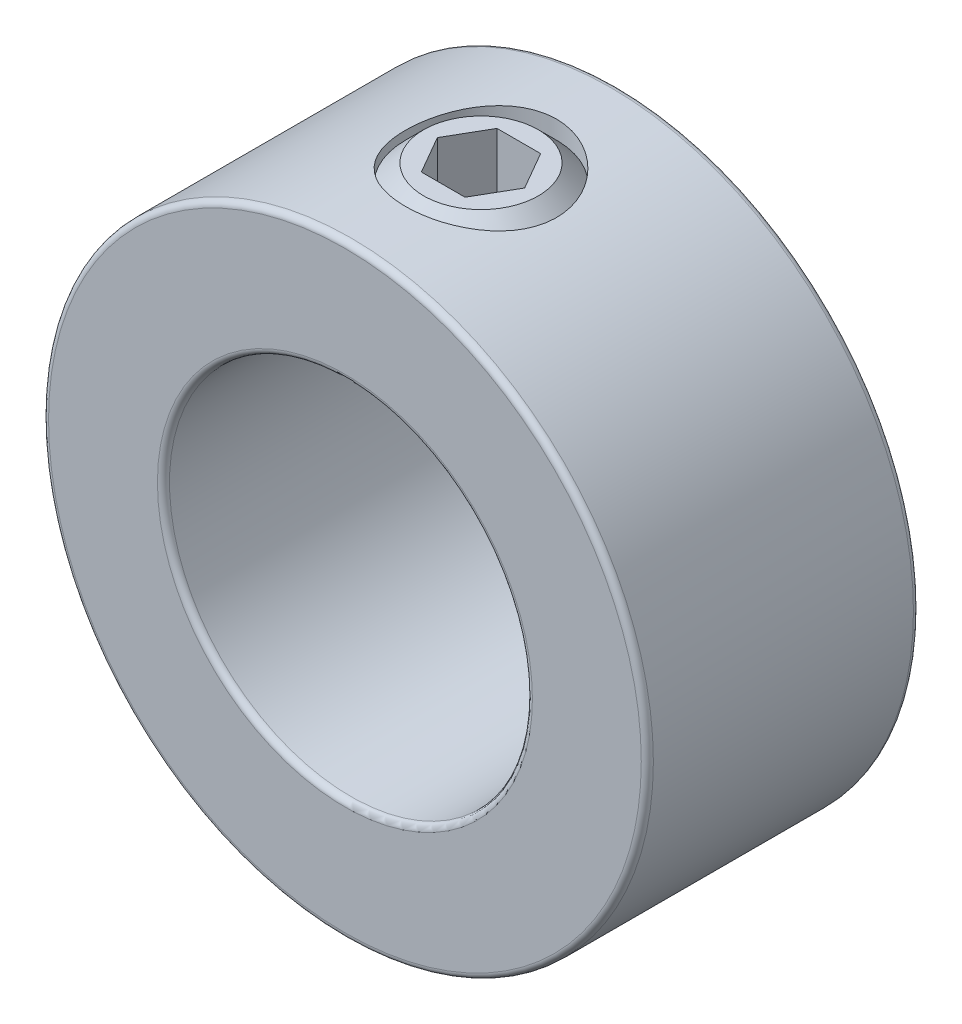
ISO-10303-21;
HEADER;
FILE_DESCRIPTION(('STEP AP214'),'2;1');
FILE_NAME('part.step','',(''),(''),'','','');
FILE_SCHEMA(('AUTOMOTIVE_DESIGN { 1 0 10303 214 1 1 1 1 }'));
ENDSEC;
DATA;
#1=APPLICATION_CONTEXT('core data for automotive mechanical design processes');
#2=APPLICATION_PROTOCOL_DEFINITION('international standard','automotive_design',2000,#1);
#3=PRODUCT_CONTEXT('',#1,'mechanical');
#4=PRODUCT('Part','Part','',(#3));
#5=PRODUCT_RELATED_PRODUCT_CATEGORY('part','',(#4));
#6=PRODUCT_DEFINITION_FORMATION('','',#4);
#7=PRODUCT_DEFINITION_CONTEXT('part definition',#1,'design');
#8=PRODUCT_DEFINITION('design','',#6,#7);
#9=PRODUCT_DEFINITION_SHAPE('','',#8);
#10=(LENGTH_UNIT() NAMED_UNIT(*) SI_UNIT(.MILLI.,.METRE.));
#11=(NAMED_UNIT(*) PLANE_ANGLE_UNIT() SI_UNIT($,.RADIAN.));
#12=(NAMED_UNIT(*) SI_UNIT($,.STERADIAN.) SOLID_ANGLE_UNIT());
#13=UNCERTAINTY_MEASURE_WITH_UNIT(LENGTH_MEASURE(1.E-05),#10,'distance_accuracy_value','');
#14=(GEOMETRIC_REPRESENTATION_CONTEXT(3) GLOBAL_UNCERTAINTY_ASSIGNED_CONTEXT((#13)) GLOBAL_UNIT_ASSIGNED_CONTEXT((#10,
#11,#12)) REPRESENTATION_CONTEXT('',''));
#15=CARTESIAN_POINT('',(0.,0.,0.));
#16=DIRECTION('',(0.,0.,1.));
#17=DIRECTION('',(1.,0.,0.));
#18=AXIS2_PLACEMENT_3D('',#15,#16,#17);
#19=CARTESIAN_POINT('',(0.,15.875,0.));
#20=DIRECTION('',(0.,1.,0.));
#21=DIRECTION('',(-1.,0.,0.));
#22=AXIS2_PLACEMENT_3D('',#19,#20,#21);
#23=PLANE('',#22);
#24=CARTESIAN_POINT('',(0.,15.875,0.));
#25=DIRECTION('',(0.,1.,0.));
#26=DIRECTION('',(-1.,0.,0.));
#27=AXIS2_PLACEMENT_3D('',#24,#25,#26);
#28=CIRCLE('',#27,3.01024078905504);
#29=CARTESIAN_POINT('',(-3.01024078905504,15.875,0.));
#30=VERTEX_POINT('',#29);
#31=EDGE_CURVE('E12',#30,#30,#28,.T.);
#32=ORIENTED_EDGE('',*,*,#31,.T.);
#33=EDGE_LOOP('',(#32));
#34=FACE_BOUND('',#33,.T.);
#35=DIRECTION('',(1.,0.,0.));
#36=VECTOR('',#35,1.);
#37=CARTESIAN_POINT('',(-1.14567944042316,15.875,-1.984375));
#38=LINE('',#37,#36);
#39=CARTESIAN_POINT('',(-1.14567944042316,15.875,-1.984375));
#40=VERTEX_POINT('',#39);
#41=CARTESIAN_POINT('',(1.14567944042317,15.875,-1.984375));
#42=VERTEX_POINT('',#41);
#43=EDGE_CURVE('E108',#40,#42,#38,.T.);
#44=ORIENTED_EDGE('',*,*,#43,.T.);
#45=DIRECTION('',(0.5,0.,0.866025403784439));
#46=VECTOR('',#45,1.);
#47=CARTESIAN_POINT('',(1.14567944042317,15.875,-1.984375));
#48=LINE('',#47,#46);
#49=CARTESIAN_POINT('',(2.29135888084633,15.875,0.));
#50=VERTEX_POINT('',#49);
#51=EDGE_CURVE('E54',#42,#50,#48,.T.);
#52=ORIENTED_EDGE('',*,*,#51,.T.);
#53=DIRECTION('',(-0.5,0.,0.866025403784439));
#54=VECTOR('',#53,1.);
#55=CARTESIAN_POINT('',(2.29135888084633,15.875,0.));
#56=LINE('',#55,#54);
#57=CARTESIAN_POINT('',(1.14567944042317,15.875,1.984375));
#58=VERTEX_POINT('',#57);
#59=EDGE_CURVE('E112',#50,#58,#56,.T.);
#60=ORIENTED_EDGE('',*,*,#59,.T.);
#61=DIRECTION('',(-1.,0.,0.));
#62=VECTOR('',#61,1.);
#63=CARTESIAN_POINT('',(1.14567944042317,15.875,1.984375));
#64=LINE('',#63,#62);
#65=CARTESIAN_POINT('',(-1.14567944042316,15.875,1.984375));
#66=VERTEX_POINT('',#65);
#67=EDGE_CURVE('E175',#58,#66,#64,.T.);
#68=ORIENTED_EDGE('',*,*,#67,.T.);
#69=DIRECTION('',(-0.5,0.,-0.866025403784438));
#70=VECTOR('',#69,1.);
#71=CARTESIAN_POINT('',(-1.14567944042316,15.875,1.984375));
#72=LINE('',#71,#70);
#73=CARTESIAN_POINT('',(-2.29135888084633,15.875,0.));
#74=VERTEX_POINT('',#73);
#75=EDGE_CURVE('E160',#66,#74,#72,.T.);
#76=ORIENTED_EDGE('',*,*,#75,.T.);
#77=DIRECTION('',(0.5,0.,-0.866025403784438));
#78=VECTOR('',#77,1.);
#79=CARTESIAN_POINT('',(-2.29135888084633,15.875,0.));
#80=LINE('',#79,#78);
#81=EDGE_CURVE('E156',#74,#40,#80,.T.);
#82=ORIENTED_EDGE('',*,*,#81,.T.);
#83=EDGE_LOOP('',(#44,#52,#60,#68,#76,#82));
#84=FACE_BOUND('',#83,.T.);
#85=ADVANCED_FACE('F40',(#34,#84),#23,.T.);
#86=CARTESIAN_POINT('',(0.,15.875,0.));
#87=DIRECTION('',(0.,-1.,0.));
#88=DIRECTION('',(1.,0.,0.));
#89=AXIS2_PLACEMENT_3D('',#86,#87,#88);
#90=CONICAL_SURFACE('',#89,3.01024078905504,0.785398163397448);
#91=CARTESIAN_POINT('',(0.,14.916490789055,0.));
#92=DIRECTION('',(0.,1.,0.));
#93=DIRECTION('',(-1.,0.,0.));
#94=AXIS2_PLACEMENT_3D('',#91,#92,#93);
#95=CIRCLE('',#94,3.96875);
#96=CARTESIAN_POINT('',(-3.96875,14.916490789055,0.));
#97=VERTEX_POINT('',#96);
#98=EDGE_CURVE('E47',#97,#97,#95,.T.);
#99=ORIENTED_EDGE('',*,*,#98,.T.);
#100=EDGE_LOOP('',(#99));
#101=FACE_BOUND('',#100,.T.);
#102=ORIENTED_EDGE('',*,*,#31,.F.);
#103=EDGE_LOOP('',(#102));
#104=FACE_BOUND('',#103,.T.);
#105=ADVANCED_FACE('F130',(#101,#104),#90,.T.);
#106=CARTESIAN_POINT('',(0.,9.525,0.));
#107=DIRECTION('',(0.,1.,0.));
#108=DIRECTION('',(-1.,0.,0.));
#109=AXIS2_PLACEMENT_3D('',#106,#107,#108);
#110=CYLINDRICAL_SURFACE('',#109,3.96875);
#111=CARTESIAN_POINT('',(0.,10.483509210945,0.));
#112=DIRECTION('',(0.,1.,0.));
#113=DIRECTION('',(-1.,0.,0.));
#114=AXIS2_PLACEMENT_3D('',#111,#112,#113);
#115=CIRCLE('',#114,3.96875);
#116=CARTESIAN_POINT('',(-3.96875,10.483509210945,0.));
#117=VERTEX_POINT('',#116);
#118=EDGE_CURVE('E125',#117,#117,#115,.T.);
#119=ORIENTED_EDGE('',*,*,#118,.T.);
#120=EDGE_LOOP('',(#119));
#121=FACE_BOUND('',#120,.T.);
#122=ORIENTED_EDGE('',*,*,#98,.F.);
#123=EDGE_LOOP('',(#122));
#124=FACE_BOUND('',#123,.T.);
#125=ADVANCED_FACE('F133',(#121,#124),#110,.T.);
#126=CARTESIAN_POINT('',(0.,10.483509210945,0.));
#127=DIRECTION('',(0.,1.,0.));
#128=DIRECTION('',(-1.,0.,0.));
#129=AXIS2_PLACEMENT_3D('',#126,#127,#128);
#130=CONICAL_SURFACE('',#129,3.96875,0.785398163397448);
#131=CARTESIAN_POINT('',(0.,9.525,0.));
#132=DIRECTION('',(0.,1.,0.));
#133=DIRECTION('',(-1.,0.,0.));
#134=AXIS2_PLACEMENT_3D('',#131,#132,#133);
#135=CIRCLE('',#134,3.01024078905504);
#136=CARTESIAN_POINT('',(-3.01024078905504,9.525,0.));
#137=VERTEX_POINT('',#136);
#138=EDGE_CURVE('E117',#137,#137,#135,.T.);
#139=ORIENTED_EDGE('',*,*,#138,.T.);
#140=EDGE_LOOP('',(#139));
#141=FACE_BOUND('',#140,.T.);
#142=ORIENTED_EDGE('',*,*,#118,.F.);
#143=EDGE_LOOP('',(#142));
#144=FACE_BOUND('',#143,.T.);
#145=ADVANCED_FACE('F135',(#141,#144),#130,.T.);
#146=CARTESIAN_POINT('',(-3.01024078905504,9.525,0.));
#147=DIRECTION('',(0.,-1.,0.));
#148=DIRECTION('',(1.,0.,0.));
#149=AXIS2_PLACEMENT_3D('',#146,#147,#148);
#150=PLANE('',#149);
#151=CARTESIAN_POINT('',(0.,9.525,0.));
#152=DIRECTION('',(0.,1.,0.));
#153=DIRECTION('',(-1.,0.,0.));
#154=AXIS2_PLACEMENT_3D('',#151,#152,#153);
#155=CIRCLE('',#154,1.15021105313395);
#156=CARTESIAN_POINT('',(-1.15021105313395,9.525,0.));
#157=VERTEX_POINT('',#156);
#158=EDGE_CURVE('E113',#157,#157,#155,.T.);
#159=ORIENTED_EDGE('',*,*,#158,.T.);
#160=EDGE_LOOP('',(#159));
#161=FACE_BOUND('',#160,.T.);
#162=ORIENTED_EDGE('',*,*,#138,.F.);
#163=EDGE_LOOP('',(#162));
#164=FACE_BOUND('',#163,.T.);
#165=ADVANCED_FACE('F142',(#161,#164),#150,.T.);
#166=CARTESIAN_POINT('',(0.,9.525,0.));
#167=DIRECTION('',(0.,-1.,0.));
#168=DIRECTION('',(1.,0.,0.));
#169=AXIS2_PLACEMENT_3D('',#166,#167,#168);
#170=CONICAL_SURFACE('',#169,1.15021105313395,0.785398163397449);
#171=CARTESIAN_POINT('',(0.,10.6752110531339,0.));
#172=VERTEX_POINT('',#171);
#173=VERTEX_LOOP('',#172);
#174=FACE_BOUND('',#173,.T.);
#175=ORIENTED_EDGE('',*,*,#158,.F.);
#176=EDGE_LOOP('',(#175));
#177=FACE_BOUND('',#176,.T.);
#178=ADVANCED_FACE('F209',(#174,#177),#170,.F.);
#179=CARTESIAN_POINT('',(1.14567944042317,11.90625,-1.984375));
#180=DIRECTION('',(-0.866025403784439,0.,0.5));
#181=DIRECTION('',(0.5,0.,0.866025403784439));
#182=AXIS2_PLACEMENT_3D('',#179,#180,#181);
#183=PLANE('',#182);
#184=ORIENTED_EDGE('',*,*,#51,.F.);
#185=DIRECTION('',(0.,1.,0.));
#186=VECTOR('',#185,1.);
#187=CARTESIAN_POINT('',(1.14567944042317,11.90625,-1.984375));
#188=LINE('',#187,#186);
#189=CARTESIAN_POINT('',(1.14567944042317,11.90625,-1.984375));
#190=VERTEX_POINT('',#189);
#191=EDGE_CURVE('E107',#190,#42,#188,.T.);
#192=ORIENTED_EDGE('',*,*,#191,.F.);
#193=DIRECTION('',(0.5,0.,0.866025403784439));
#194=VECTOR('',#193,1.);
#195=CARTESIAN_POINT('',(1.14567944042317,11.90625,-1.984375));
#196=LINE('',#195,#194);
#197=CARTESIAN_POINT('',(2.29135888084633,11.90625,0.));
#198=VERTEX_POINT('',#197);
#199=EDGE_CURVE('E98',#190,#198,#196,.T.);
#200=ORIENTED_EDGE('',*,*,#199,.T.);
#201=DIRECTION('',(0.,1.,0.));
#202=VECTOR('',#201,1.);
#203=CARTESIAN_POINT('',(2.29135888084633,11.90625,0.));
#204=LINE('',#203,#202);
#205=EDGE_CURVE('E106',#198,#50,#204,.T.);
#206=ORIENTED_EDGE('',*,*,#205,.T.);
#207=EDGE_LOOP('',(#184,#192,#200,#206));
#208=FACE_BOUND('',#207,.T.);
#209=ADVANCED_FACE('F105',(#208),#183,.T.);
#210=CARTESIAN_POINT('',(2.29135888084633,11.90625,0.));
#211=DIRECTION('',(-0.866025403784439,0.,-0.5));
#212=DIRECTION('',(-0.5,0.,0.866025403784439));
#213=AXIS2_PLACEMENT_3D('',#210,#211,#212);
#214=PLANE('',#213);
#215=ORIENTED_EDGE('',*,*,#59,.F.);
#216=ORIENTED_EDGE('',*,*,#205,.F.);
#217=DIRECTION('',(-0.5,0.,0.866025403784439));
#218=VECTOR('',#217,1.);
#219=CARTESIAN_POINT('',(2.29135888084633,11.90625,0.));
#220=LINE('',#219,#218);
#221=CARTESIAN_POINT('',(1.14567944042317,11.90625,1.984375));
#222=VERTEX_POINT('',#221);
#223=EDGE_CURVE('E94',#198,#222,#220,.T.);
#224=ORIENTED_EDGE('',*,*,#223,.T.);
#225=DIRECTION('',(0.,1.,0.));
#226=VECTOR('',#225,1.);
#227=CARTESIAN_POINT('',(1.14567944042317,11.90625,1.984375));
#228=LINE('',#227,#226);
#229=EDGE_CURVE('E114',#222,#58,#228,.T.);
#230=ORIENTED_EDGE('',*,*,#229,.T.);
#231=EDGE_LOOP('',(#215,#216,#224,#230));
#232=FACE_BOUND('',#231,.T.);
#233=ADVANCED_FACE('F110',(#232),#214,.T.);
#234=CARTESIAN_POINT('',(1.14567944042317,11.90625,1.984375));
#235=DIRECTION('',(0.,0.,-1.));
#236=DIRECTION('',(-1.,0.,0.));
#237=AXIS2_PLACEMENT_3D('',#234,#235,#236);
#238=PLANE('',#237);
#239=ORIENTED_EDGE('',*,*,#67,.F.);
#240=ORIENTED_EDGE('',*,*,#229,.F.);
#241=DIRECTION('',(-1.,0.,0.));
#242=VECTOR('',#241,1.);
#243=CARTESIAN_POINT('',(1.14567944042317,11.90625,1.984375));
#244=LINE('',#243,#242);
#245=CARTESIAN_POINT('',(-1.14567944042316,11.90625,1.984375));
#246=VERTEX_POINT('',#245);
#247=EDGE_CURVE('E100',#222,#246,#244,.T.);
#248=ORIENTED_EDGE('',*,*,#247,.T.);
#249=DIRECTION('',(0.,1.,0.));
#250=VECTOR('',#249,1.);
#251=CARTESIAN_POINT('',(-1.14567944042316,11.90625,1.984375));
#252=LINE('',#251,#250);
#253=EDGE_CURVE('E119',#246,#66,#252,.T.);
#254=ORIENTED_EDGE('',*,*,#253,.T.);
#255=EDGE_LOOP('',(#239,#240,#248,#254));
#256=FACE_BOUND('',#255,.T.);
#257=ADVANCED_FACE('F173',(#256),#238,.T.);
#258=CARTESIAN_POINT('',(-1.14567944042316,11.90625,1.984375));
#259=DIRECTION('',(0.866025403784438,0.,-0.5));
#260=DIRECTION('',(-0.5,0.,-0.866025403784439));
#261=AXIS2_PLACEMENT_3D('',#258,#259,#260);
#262=PLANE('',#261);
#263=ORIENTED_EDGE('',*,*,#75,.F.);
#264=ORIENTED_EDGE('',*,*,#253,.F.);
#265=DIRECTION('',(-0.5,0.,-0.866025403784438));
#266=VECTOR('',#265,1.);
#267=CARTESIAN_POINT('',(-1.14567944042316,11.90625,1.984375));
#268=LINE('',#267,#266);
#269=CARTESIAN_POINT('',(-2.29135888084633,11.90625,0.));
#270=VERTEX_POINT('',#269);
#271=EDGE_CURVE('E186',#246,#270,#268,.T.);
#272=ORIENTED_EDGE('',*,*,#271,.T.);
#273=DIRECTION('',(0.,1.,0.));
#274=VECTOR('',#273,1.);
#275=CARTESIAN_POINT('',(-2.29135888084633,11.90625,0.));
#276=LINE('',#275,#274);
#277=EDGE_CURVE('E168',#270,#74,#276,.T.);
#278=ORIENTED_EDGE('',*,*,#277,.T.);
#279=EDGE_LOOP('',(#263,#264,#272,#278));
#280=FACE_BOUND('',#279,.T.);
#281=ADVANCED_FACE('F177',(#280),#262,.T.);
#282=CARTESIAN_POINT('',(-2.29135888084633,11.90625,0.));
#283=DIRECTION('',(0.866025403784438,0.,0.5));
#284=DIRECTION('',(0.5,0.,-0.866025403784439));
#285=AXIS2_PLACEMENT_3D('',#282,#283,#284);
#286=PLANE('',#285);
#287=ORIENTED_EDGE('',*,*,#81,.F.);
#288=ORIENTED_EDGE('',*,*,#277,.F.);
#289=DIRECTION('',(0.5,0.,-0.866025403784438));
#290=VECTOR('',#289,1.);
#291=CARTESIAN_POINT('',(-2.29135888084633,11.90625,0.));
#292=LINE('',#291,#290);
#293=CARTESIAN_POINT('',(-1.14567944042316,11.90625,-1.984375));
#294=VERTEX_POINT('',#293);
#295=EDGE_CURVE('E184',#270,#294,#292,.T.);
#296=ORIENTED_EDGE('',*,*,#295,.T.);
#297=DIRECTION('',(0.,1.,0.));
#298=VECTOR('',#297,1.);
#299=CARTESIAN_POINT('',(-1.14567944042316,11.90625,-1.984375));
#300=LINE('',#299,#298);
#301=EDGE_CURVE('E165',#294,#40,#300,.T.);
#302=ORIENTED_EDGE('',*,*,#301,.T.);
#303=EDGE_LOOP('',(#287,#288,#296,#302));
#304=FACE_BOUND('',#303,.T.);
#305=ADVANCED_FACE('F190',(#304),#286,.T.);
#306=CARTESIAN_POINT('',(-1.14567944042316,11.90625,-1.984375));
#307=DIRECTION('',(0.,0.,1.));
#308=DIRECTION('',(1.,0.,0.));
#309=AXIS2_PLACEMENT_3D('',#306,#307,#308);
#310=PLANE('',#309);
#311=ORIENTED_EDGE('',*,*,#43,.F.);
#312=ORIENTED_EDGE('',*,*,#301,.F.);
#313=DIRECTION('',(1.,0.,0.));
#314=VECTOR('',#313,1.);
#315=CARTESIAN_POINT('',(-1.14567944042316,11.90625,-1.984375));
#316=LINE('',#315,#314);
#317=EDGE_CURVE('E166',#294,#190,#316,.T.);
#318=ORIENTED_EDGE('',*,*,#317,.T.);
#319=ORIENTED_EDGE('',*,*,#191,.T.);
#320=EDGE_LOOP('',(#311,#312,#318,#319));
#321=FACE_BOUND('',#320,.T.);
#322=ADVANCED_FACE('F191',(#321),#310,.T.);
#323=CARTESIAN_POINT('',(0.,11.90625,-3.96875));
#324=DIRECTION('',(0.,1.,0.));
#325=DIRECTION('',(0.,0.,1.));
#326=AXIS2_PLACEMENT_3D('',#323,#324,#325);
#327=PLANE('',#326);
#328=ORIENTED_EDGE('',*,*,#199,.F.);
#329=ORIENTED_EDGE('',*,*,#317,.F.);
#330=ORIENTED_EDGE('',*,*,#295,.F.);
#331=ORIENTED_EDGE('',*,*,#271,.F.);
#332=ORIENTED_EDGE('',*,*,#247,.F.);
#333=ORIENTED_EDGE('',*,*,#223,.F.);
#334=EDGE_LOOP('',(#328,#329,#330,#331,#332,#333));
#335=FACE_BOUND('',#334,.T.);
#336=ADVANCED_FACE('F96',(#335),#327,.T.);
#337=CLOSED_SHELL('',(#85,#105,#125,#145,#165,#178,#209,#233,#257,#281,#305,#322,#336));
#338=MANIFOLD_SOLID_BREP('B2',#337);
#339=CARTESIAN_POINT('',(0.,0.,7.14375));
#340=DIRECTION('',(0.,0.,1.));
#341=DIRECTION('',(1.,0.,0.));
#342=AXIS2_PLACEMENT_3D('',#339,#340,#341);
#343=PLANE('',#342);
#344=CARTESIAN_POINT('',(0.,0.,7.14375));
#345=DIRECTION('',(0.,0.,1.));
#346=DIRECTION('',(1.,0.,0.));
#347=AXIS2_PLACEMENT_3D('',#344,#345,#346);
#348=CIRCLE('',#347,9.8425);
#349=CARTESIAN_POINT('',(9.8425,0.,7.14375));
#350=VERTEX_POINT('',#349);
#351=EDGE_CURVE('E305',#350,#350,#348,.F.);
#352=ORIENTED_EDGE('',*,*,#351,.T.);
#353=EDGE_LOOP('',(#352));
#354=FACE_BOUND('',#353,.T.);
#355=CARTESIAN_POINT('',(0.,0.,7.14375));
#356=DIRECTION('',(0.,0.,1.));
#357=DIRECTION('',(1.,0.,0.));
#358=AXIS2_PLACEMENT_3D('',#355,#356,#357);
#359=CIRCLE('',#358,15.5575);
#360=CARTESIAN_POINT('',(15.5575,0.,7.14375));
#361=VERTEX_POINT('',#360);
#362=EDGE_CURVE('E309',#361,#361,#359,.T.);
#363=ORIENTED_EDGE('',*,*,#362,.T.);
#364=EDGE_LOOP('',(#363));
#365=FACE_BOUND('',#364,.T.);
#366=ADVANCED_FACE('F294',(#354,#365),#343,.T.);
#367=CARTESIAN_POINT('',(0.,0.,-7.14375));
#368=DIRECTION('',(0.,0.,1.));
#369=DIRECTION('',(1.,0.,0.));
#370=AXIS2_PLACEMENT_3D('',#367,#368,#369);
#371=PLANE('',#370);
#372=CARTESIAN_POINT('',(0.,0.,-7.14375));
#373=DIRECTION('',(0.,0.,1.));
#374=DIRECTION('',(1.,0.,0.));
#375=AXIS2_PLACEMENT_3D('',#372,#373,#374);
#376=CIRCLE('',#375,9.8425);
#377=CARTESIAN_POINT('',(9.8425,0.,-7.14375));
#378=VERTEX_POINT('',#377);
#379=EDGE_CURVE('E320',#378,#378,#376,.T.);
#380=ORIENTED_EDGE('',*,*,#379,.T.);
#381=EDGE_LOOP('',(#380));
#382=FACE_BOUND('',#381,.T.);
#383=CARTESIAN_POINT('',(0.,0.,-7.14375));
#384=DIRECTION('',(0.,0.,1.));
#385=DIRECTION('',(1.,0.,0.));
#386=AXIS2_PLACEMENT_3D('',#383,#384,#385);
#387=CIRCLE('',#386,15.5575);
#388=CARTESIAN_POINT('',(15.5575,0.,-7.14375));
#389=VERTEX_POINT('',#388);
#390=EDGE_CURVE('E323',#389,#389,#387,.F.);
#391=ORIENTED_EDGE('',*,*,#390,.T.);
#392=EDGE_LOOP('',(#391));
#393=FACE_BOUND('',#392,.T.);
#394=ADVANCED_FACE('F357',(#382,#393),#371,.F.);
#395=CARTESIAN_POINT('',(0.,0.,7.14375));
#396=DIRECTION('',(0.,0.,-1.));
#397=DIRECTION('',(-1.,0.,0.));
#398=AXIS2_PLACEMENT_3D('',#395,#396,#397);
#399=CYLINDRICAL_SURFACE('',#398,15.875);
#400=CARTESIAN_POINT('',(0.,0.,-6.82625));
#401=DIRECTION('',(0.,0.,1.));
#402=DIRECTION('',(1.,0.,0.));
#403=AXIS2_PLACEMENT_3D('',#400,#401,#402);
#404=CIRCLE('',#403,15.875);
#405=CARTESIAN_POINT('',(15.875,0.,-6.82625));
#406=VERTEX_POINT('',#405);
#407=EDGE_CURVE('E39',#406,#406,#404,.T.);
#408=ORIENTED_EDGE('',*,*,#407,.T.);
#409=EDGE_LOOP('',(#408));
#410=FACE_BOUND('',#409,.T.);
#411=CARTESIAN_POINT('',(0.,0.,6.82625));
#412=DIRECTION('',(0.,0.,1.));
#413=DIRECTION('',(1.,0.,0.));
#414=AXIS2_PLACEMENT_3D('',#411,#412,#413);
#415=CIRCLE('',#414,15.875);
#416=CARTESIAN_POINT('',(15.875,0.,6.82625));
#417=VERTEX_POINT('',#416);
#418=EDGE_CURVE('E301',#417,#417,#415,.F.);
#419=ORIENTED_EDGE('',*,*,#418,.T.);
#420=EDGE_LOOP('',(#419));
#421=FACE_BOUND('',#420,.T.);
#422=CARTESIAN_POINT('',(0.,15.875,-3.96875));
#423=CARTESIAN_POINT('',(0.219276317938663,15.8749962923412,-3.96874384648445));
#424=CARTESIAN_POINT('',(0.438621375927227,15.8704115464046,-3.95051610524435));
#425=CARTESIAN_POINT('',(0.871025064976201,15.8525663450826,-3.87819595383355));
#426=CARTESIAN_POINT('',(1.08408006151217,15.8393009725702,-3.8240832164311));
#427=CARTESIAN_POINT('',(1.49759689098307,15.8055634467017,-3.68183780854823));
#428=CARTESIAN_POINT('',(1.69807351157521,15.7850999501961,-3.59374599089918));
#429=CARTESIAN_POINT('',(2.08140334899713,15.73914555491,-3.38618673883969));
#430=CARTESIAN_POINT('',(2.26425597108944,15.7136544865579,-3.2667182461019));
#431=CARTESIAN_POINT('',(2.61091343265034,15.6598253179469,-2.99719791070665));
#432=CARTESIAN_POINT('',(2.77430359661988,15.6314432932942,-2.84662145792082));
#433=CARTESIAN_POINT('',(3.07379403655878,15.5753228656204,-2.52028270784484));
#434=CARTESIAN_POINT('',(3.20989123109474,15.5475845355861,-2.34451757053623));
#435=CARTESIAN_POINT('',(3.45288272782229,15.4954492736807,-1.96957096259171));
#436=CARTESIAN_POINT('',(3.55931315463527,15.4711081035481,-1.7700804101519));
#437=CARTESIAN_POINT('',(3.73696682054051,15.42916371706,-1.35533232748282));
#438=CARTESIAN_POINT('',(3.80819568835204,15.4115594235815,-1.14007732430904));
#439=CARTESIAN_POINT('',(3.91200967237927,15.3855334459235,-0.704470327674773));
#440=CARTESIAN_POINT('',(3.94534037662856,15.3769348659626,-0.484306837566144));
#441=CARTESIAN_POINT('',(3.97473427986321,15.3693643817434,-0.0413581611892298));
#442=CARTESIAN_POINT('',(3.97080354189375,15.3703909113223,0.181426592664615));
#443=CARTESIAN_POINT('',(3.92638101310922,15.3817956459658,0.617579324659582));
#444=CARTESIAN_POINT('',(3.88677769175439,15.3919465837346,0.831044665127022));
#445=CARTESIAN_POINT('',(3.77355149451417,15.4200941933804,1.24820111386884));
#446=CARTESIAN_POINT('',(3.6999261950586,15.4380914241861,1.45189152468069));
#447=CARTESIAN_POINT('',(3.51998882704214,15.4801123887539,1.84609850133376));
#448=CARTESIAN_POINT('',(3.41335430705377,15.5041951226389,2.03646132952657));
#449=CARTESIAN_POINT('',(3.17065098028955,15.5556402661335,2.39690991956492));
#450=CARTESIAN_POINT('',(3.03457702289005,15.5830032492704,2.5669921250946));
#451=CARTESIAN_POINT('',(2.73225531113573,15.638882672618,2.88714289985811));
#452=CARTESIAN_POINT('',(2.56525780806384,15.6674097549388,3.03650250495399));
#453=CARTESIAN_POINT('',(2.20824403172854,15.7216995059379,3.30523120401908));
#454=CARTESIAN_POINT('',(2.01822705560227,15.7474620901614,3.42459938190569));
#455=CARTESIAN_POINT('',(1.61955662213618,15.7934483283255,3.63021717605202));
#456=CARTESIAN_POINT('',(1.41084139453115,15.8136526533794,3.71635162942318));
#457=CARTESIAN_POINT('',(0.981276104878046,15.8461053037312,3.85211453802325));
#458=CARTESIAN_POINT('',(0.760428372752325,15.8583551508518,3.90174997635633));
#459=CARTESIAN_POINT('',(0.318928671656947,15.8732934182218,3.96202314220776));
#460=CARTESIAN_POINT('',(0.0984163216354739,15.8762184990732,3.97362633982424));
#461=CARTESIAN_POINT('',(-0.341399481245656,15.8728517107157,3.96015368206153));
#462=CARTESIAN_POINT('',(-0.560703041142993,15.8665606711907,3.93508112842729));
#463=CARTESIAN_POINT('',(-0.988521086137797,15.8456201673278,3.84976447154782));
#464=CARTESIAN_POINT('',(-1.19714729393815,15.8310959461656,3.79004707371718));
#465=CARTESIAN_POINT('',(-1.60140991961395,15.7953261963621,3.63773750684137));
#466=CARTESIAN_POINT('',(-1.79704502327389,15.7740799889558,3.54514201775461));
#467=CARTESIAN_POINT('',(-2.17361329317892,15.7266562722145,3.32783357568576));
#468=CARTESIAN_POINT('',(-2.35422398152379,15.7003979490741,3.20257986928408));
#469=CARTESIAN_POINT('',(-2.69220583193126,15.6459901389264,2.92420169964084));
#470=CARTESIAN_POINT('',(-2.8495729747834,15.6178403260695,2.77107242642835));
#471=CARTESIAN_POINT('',(-3.14057921135844,15.5619703195514,2.43680731193433));
#472=CARTESIAN_POINT('',(-3.27354106641412,15.5342776314873,2.25507628581352));
#473=CARTESIAN_POINT('',(-3.50708054989026,15.4832282405322,1.87131157130203));
#474=CARTESIAN_POINT('',(-3.60765961580222,15.4598713451923,1.66927878464125));
#475=CARTESIAN_POINT('',(-3.77282980035675,15.4203954226879,1.25172860946629));
#476=CARTESIAN_POINT('',(-3.83763413278554,15.4042336277389,1.03629981675504));
#477=CARTESIAN_POINT('',(-3.92997705859964,15.3809367690691,0.597139083176547));
#478=CARTESIAN_POINT('',(-3.95752380186566,15.3737997312575,0.37340896917992));
#479=CARTESIAN_POINT('',(-3.97414377026343,15.3695109277681,-0.0691118756504947));
#480=CARTESIAN_POINT('',(-3.96429943786923,15.3720782188607,-0.287859880484356));
#481=CARTESIAN_POINT('',(-3.90889404885913,15.3862592576868,-0.720470705470319));
#482=CARTESIAN_POINT('',(-3.86333371002422,15.3978728236181,-0.934333623708624));
#483=CARTESIAN_POINT('',(-3.73838078269613,15.428681272623,-1.3499265479296));
#484=CARTESIAN_POINT('',(-3.65919121655116,15.447830611566,-1.55172120344421));
#485=CARTESIAN_POINT('',(-3.46938841724575,15.4915593701141,-1.93930424176713));
#486=CARTESIAN_POINT('',(-3.35877082571519,15.5161395427502,-2.12509039989142));
#487=CARTESIAN_POINT('',(-3.10585841826937,15.5687615732514,-2.48061328923344));
#488=CARTESIAN_POINT('',(-2.96281253520542,15.5968770070148,-2.64980492343393));
#489=CARTESIAN_POINT('',(-2.65056771127277,15.6529623875501,-2.9621348893548));
#490=CARTESIAN_POINT('',(-2.48136256875343,15.680932298193,-3.1052670255073));
#491=CARTESIAN_POINT('',(-2.11790382315062,15.7341796390132,-3.36394242057711));
#492=CARTESIAN_POINT('',(-1.92325207571211,15.7593991328058,-3.47893908200603));
#493=CARTESIAN_POINT('',(-1.51676644912146,15.8036928066328,-3.67439432903017));
#494=CARTESIAN_POINT('',(-1.30494501159304,15.8227713875774,-3.75487766254925));
#495=CARTESIAN_POINT('',(-0.911252128373354,15.8498132426717,-3.8670754677472));
#496=CARTESIAN_POINT('',(-0.731255868860932,15.8591933961858,-3.90512099724554));
#497=CARTESIAN_POINT('',(-0.367522314273083,15.8717880967619,-3.95595989249972));
#498=CARTESIAN_POINT('',(-0.183785301621089,15.8750031075549,-3.96875515753694));
#499=CARTESIAN_POINT('',(0.,15.875,-3.96875));
#500=B_SPLINE_CURVE_WITH_KNOTS('',3,(#422,#423,#424,#425,#426,#427,#428,#429,#430,#431,#432,
#433,#434,#435,#436,#437,#438,#439,#440,#441,#442,#443,#444,#445,#446,#447,#448,#449,#450,#451,
#452,#453,#454,#455,#456,#457,#458,#459,#460,#461,#462,#463,#464,#465,#466,#467,#468,#469,#470,
#471,#472,#473,#474,#475,#476,#477,#478,#479,#480,#481,#482,#483,#484,#485,#486,#487,#488,#489,
#490,#491,#492,#493,#494,#495,#496,#497,#498,#499),.UNSPECIFIED.,.T.,.F.,(4,2,2,2,2,2,2,2,2,2,2,
2,2,2,2,2,2,2,2,2,2,2,2,2,2,2,2,2,2,2,2,2,2,2,2,2,2,2,4),(0.,0.657155447581875,1.31468346241698,
1.97142338729866,2.62818546669801,3.29709027094097,3.96607055347247,4.64498921631614,
5.32379928510621,5.98901030788247,6.65411309181963,7.30309523339855,7.95212361262679,
8.60770355008425,9.26339827846133,9.9377897132265,10.6122017446498,11.288930225954,
11.9655291997665,12.6248135910375,13.2840386336958,13.9334947632718,14.5830164938235,
15.2440636710878,15.9052250213417,16.5826151394563,17.2599751836686,17.93325340345,
18.6063843237088,19.2601791898969,19.9139609171722,20.5638505983458,21.2138304488326,
21.8807658760559,22.5478596587194,23.2270349082203,23.9057223346503,24.4565551780548,
25.0073465871825),.UNSPECIFIED.);
#501=CARTESIAN_POINT('',(0.,15.875,-3.96875));
#502=VERTEX_POINT('',#501);
#503=EDGE_CURVE('E326',#502,#502,#500,.T.);
#504=ORIENTED_EDGE('',*,*,#503,.T.);
#505=EDGE_LOOP('',(#504));
#506=FACE_BOUND('',#505,.T.);
#507=ADVANCED_FACE('F353',(#410,#421,#506),#399,.T.);
#508=CARTESIAN_POINT('',(0.,0.,7.14375));
#509=DIRECTION('',(0.,0.,-1.));
#510=DIRECTION('',(-1.,0.,0.));
#511=AXIS2_PLACEMENT_3D('',#508,#509,#510);
#512=CYLINDRICAL_SURFACE('',#511,9.525);
#513=CARTESIAN_POINT('',(0.,0.,-6.82625));
#514=DIRECTION('',(0.,0.,1.));
#515=DIRECTION('',(1.,0.,0.));
#516=AXIS2_PLACEMENT_3D('',#513,#514,#515);
#517=CIRCLE('',#516,9.525);
#518=CARTESIAN_POINT('',(9.525,0.,-6.82625));
#519=VERTEX_POINT('',#518);
#520=EDGE_CURVE('E314',#519,#519,#517,.F.);
#521=ORIENTED_EDGE('',*,*,#520,.T.);
#522=EDGE_LOOP('',(#521));
#523=FACE_BOUND('',#522,.T.);
#524=CARTESIAN_POINT('',(0.,0.,6.82625));
#525=DIRECTION('',(0.,0.,1.));
#526=DIRECTION('',(1.,0.,0.));
#527=AXIS2_PLACEMENT_3D('',#524,#525,#526);
#528=CIRCLE('',#527,9.525);
#529=CARTESIAN_POINT('',(9.525,0.,6.82625));
#530=VERTEX_POINT('',#529);
#531=EDGE_CURVE('E317',#530,#530,#528,.T.);
#532=ORIENTED_EDGE('',*,*,#531,.T.);
#533=EDGE_LOOP('',(#532));
#534=FACE_BOUND('',#533,.T.);
#535=CARTESIAN_POINT('',(0.,9.525,-3.96875));
#536=CARTESIAN_POINT('',(0.106339704110791,9.52499940431026,-3.96874924420082));
#537=CARTESIAN_POINT('',(0.212715681361909,9.52321418687749,-3.96447001336336));
#538=CARTESIAN_POINT('',(0.424708606879246,9.51611852971387,-3.94739427644123));
#539=CARTESIAN_POINT('',(0.530325032060799,9.51080585924981,-3.93459238067755));
#540=CARTESIAN_POINT('',(0.740196085308891,9.49677884054498,-3.90056443710289));
#541=CARTESIAN_POINT('',(0.844447466681659,9.48805752018966,-3.8793211215613));
#542=CARTESIAN_POINT('',(1.05063078746721,9.46744770745331,-3.82863481224293));
#543=CARTESIAN_POINT('',(1.15256176045451,9.45555792071836,-3.79918846721341));
#544=CARTESIAN_POINT('',(1.45304856102099,9.41566954873609,-3.69918624362517));
#545=CARTESIAN_POINT('',(1.64725042578752,9.38338421186795,-3.61681028624573));
#546=CARTESIAN_POINT('',(2.01878960760281,9.31053593336086,-3.4233641905776));
#547=CARTESIAN_POINT('',(2.1961320108023,9.2699754998386,-3.31230274392849));
#548=CARTESIAN_POINT('',(2.53824093920422,9.18234884286996,-3.05870239023164));
#549=CARTESIAN_POINT('',(2.70205730367417,9.13506952420801,-2.91495316865579));
#550=CARTESIAN_POINT('',(3.00405615198818,9.04026456603983,-2.60267091834204));
#551=CARTESIAN_POINT('',(3.14222513903648,8.99273881029334,-2.43412492359048));
#552=CARTESIAN_POINT('',(3.39579467666476,8.9001883806779,-2.06679786086128));
#553=CARTESIAN_POINT('',(3.50974047292495,8.85540182052122,-1.86693718272473));
#554=CARTESIAN_POINT('',(3.65386256626164,8.79645372122562,-1.55355911222668));
#555=CARTESIAN_POINT('',(3.69744892615389,8.7781707903278,-1.44679096419393));
#556=CARTESIAN_POINT('',(3.77528941119493,8.74497623698359,-1.22941680377217));
#557=CARTESIAN_POINT('',(3.80954833407463,8.73006288201086,-1.11881279755699));
#558=CARTESIAN_POINT('',(3.86694170240058,8.70478736192303,-0.899958333449478));
#559=CARTESIAN_POINT('',(3.89052895323577,8.69424199074779,-0.791847389406901));
#560=CARTESIAN_POINT('',(3.92861373354644,8.6770995707797,-0.573771115071432));
#561=CARTESIAN_POINT('',(3.94311546377092,8.67050069736238,-0.463806665945382));
#562=CARTESIAN_POINT('',(3.9628609387512,8.66149391151971,-0.242906411230522));
#563=CARTESIAN_POINT('',(3.96810707162349,8.65908491802959,-0.131970863629314));
#564=CARTESIAN_POINT('',(3.96928172781075,8.65854653232212,0.0899554305756057));
#565=CARTESIAN_POINT('',(3.96521074158957,8.6604169148335,0.200946173966248));
#566=CARTESIAN_POINT('',(3.94847322291752,8.66805984388474,0.413533747050384));
#567=CARTESIAN_POINT('',(3.9364922679005,8.67352102353331,0.515196191446444));
#568=CARTESIAN_POINT('',(3.90477208316464,8.68784624326787,0.717069866389163));
#569=CARTESIAN_POINT('',(3.88503031625091,8.696711396172,0.817280611220544));
#570=CARTESIAN_POINT('',(3.81443477338007,8.72802607625492,1.11466693937905));
#571=CARTESIAN_POINT('',(3.75219655480153,8.75520186013044,1.30877252533341));
#572=CARTESIAN_POINT('',(3.59796791715169,8.8197115743198,1.68772720033092));
#573=CARTESIAN_POINT('',(3.50537257326444,8.85724935772168,1.87229142439091));
#574=CARTESIAN_POINT('',(3.29346810049256,8.93820695787082,2.22400833873649));
#575=CARTESIAN_POINT('',(3.17414843672175,8.98162909159069,2.39115412439081));
#576=CARTESIAN_POINT('',(2.90034934429311,9.07392703271809,2.71811992170748));
#577=CARTESIAN_POINT('',(2.74375071631135,9.12295360910874,2.87612703603657));
#578=CARTESIAN_POINT('',(2.40579154448283,9.21784011680501,3.16424718714745));
#579=CARTESIAN_POINT('',(2.22442521639882,9.26369930462193,3.29435368973569));
#580=CARTESIAN_POINT('',(1.83657221137101,9.34841550416938,3.52563392964764));
#581=CARTESIAN_POINT('',(1.62960234239378,9.38708646308532,3.62607053905012));
#582=CARTESIAN_POINT('',(1.1996813848965,9.4516410345857,3.79006456757172));
#583=CARTESIAN_POINT('',(0.976739205259847,9.47753171301731,3.85364236825926));
#584=CARTESIAN_POINT('',(0.536346758201593,9.51228860774907,3.93832078733203));
#585=CARTESIAN_POINT('',(0.319440830312387,9.52212792826799,3.96185345068165));
#586=CARTESIAN_POINT('',(-0.115426030752915,9.52677959918588,3.97302425667797));
#587=CARTESIAN_POINT('',(-0.333386643092933,9.52159626384832,3.96067270468772));
#588=CARTESIAN_POINT('',(-0.752786919544947,9.4974161606133,3.90216680656033));
#589=CARTESIAN_POINT('',(-0.954509669108729,9.47911767126829,3.85772039596071));
#590=CARTESIAN_POINT('',(-1.34741522795453,9.43129326502252,3.73866348211369));
#591=CARTESIAN_POINT('',(-1.53859670219198,9.40176592971954,3.6640491680502));
#592=CARTESIAN_POINT('',(-1.91169607458845,9.33317509298509,3.48433715217342));
#593=CARTESIAN_POINT('',(-2.09314172700116,9.29384385415235,3.37836451851939));
#594=CARTESIAN_POINT('',(-2.43632423654929,9.20984329538344,3.13990552550333));
#595=CARTESIAN_POINT('',(-2.59805281957313,9.16517174989766,3.0074080964218));
#596=CARTESIAN_POINT('',(-2.90935864105439,9.07135879069044,2.70858223433093));
#597=CARTESIAN_POINT('',(-3.05724146582754,9.02212608805477,2.54051275288849));
#598=CARTESIAN_POINT('',(-3.32317676164348,8.92760269234456,2.1811574490353));
#599=CARTESIAN_POINT('',(-3.44122245828602,8.88231289601852,1.98986636882128));
#600=CARTESIAN_POINT('',(-3.64540673564475,8.80050901339689,1.58554999291579));
#601=CARTESIAN_POINT('',(-3.73106690034735,8.76412911168938,1.37225393536599));
#602=CARTESIAN_POINT('',(-3.86452789664724,8.70611529160776,0.932273366525801));
#603=CARTESIAN_POINT('',(-3.91235994567535,8.68446921628956,0.705600061106097));
#604=CARTESIAN_POINT('',(-3.96570453838301,8.66023047600162,0.264100623589918));
#605=CARTESIAN_POINT('',(-3.97419128243223,8.65629940020154,0.0497056739996089));
#606=CARTESIAN_POINT('',(-3.95654456856183,8.66437982610696,-0.377326060905214));
#607=CARTESIAN_POINT('',(-3.93041642538565,8.67638888037756,-0.589963111082611));
#608=CARTESIAN_POINT('',(-3.84677918968913,8.71377327866252,-0.99724455560429));
#609=CARTESIAN_POINT('',(-3.79078759664359,8.73850035697025,-1.19226573903111));
#610=CARTESIAN_POINT('',(-3.65049901233461,8.79802591245427,-1.57018966693978));
#611=CARTESIAN_POINT('',(-3.56619406749029,8.83282721922989,-1.7530889889312));
#612=CARTESIAN_POINT('',(-3.36582424000278,8.91117616528711,-2.11358565826454));
#613=CARTESIAN_POINT('',(-3.2481544891375,8.95512388439339,-2.2902029575896));
#614=CARTESIAN_POINT('',(-2.98668090348688,9.04569075374843,-2.62210138158151));
#615=CARTESIAN_POINT('',(-2.84286800697565,9.09231082643891,-2.77737507526119));
#616=CARTESIAN_POINT('',(-2.52060299354103,9.18707098471588,-3.07389036395108));
#617=CARTESIAN_POINT('',(-2.34039087540219,9.23507447466898,-3.21328628885679));
#618=CARTESIAN_POINT('',(-2.05338852131444,9.30155622819451,-3.39817492049314));
#619=CARTESIAN_POINT('',(-1.95485248361422,9.32281142897058,-3.45580765382273));
#620=CARTESIAN_POINT('',(-1.7528076554782,9.36289852055438,-3.56253706293522));
#621=CARTESIAN_POINT('',(-1.64930118613718,9.38173152765293,-3.61163767451636));
#622=CARTESIAN_POINT('',(-1.43970220933929,9.41615560801286,-3.70013143117591));
#623=CARTESIAN_POINT('',(-1.33367770464093,9.43179378843126,-3.73966750311787));
#624=CARTESIAN_POINT('',(-1.11828343863684,9.4597489373536,-3.80962337808587));
#625=CARTESIAN_POINT('',(-1.0089152912531,9.47206748086749,-3.84004750506259));
#626=CARTESIAN_POINT('',(-0.787917389017962,9.49300284455447,-3.89140117159789));
#627=CARTESIAN_POINT('',(-0.676293942040783,9.50162880353856,-3.91235415864672));
#628=CARTESIAN_POINT('',(-0.451486990346163,9.51495896057856,-3.944618314061));
#629=CARTESIAN_POINT('',(-0.338304692950859,9.51966603732563,-3.9559365599505));
#630=CARTESIAN_POINT('',(-0.187413035354011,9.52322990511202,-3.96450008063218));
#631=CARTESIAN_POINT('',(-0.14995271019202,9.52389333055183,-3.96609336524365));
#632=CARTESIAN_POINT('',(-0.0749964270699488,9.52477848366261,-3.96821845971286));
#633=CARTESIAN_POINT('',(-0.0375004690081374,9.52500021006871,-3.96875026653096));
#634=CARTESIAN_POINT('',(0.,9.525,-3.96875));
#635=B_SPLINE_CURVE_WITH_KNOTS('',3,(#535,#536,#537,#538,#539,#540,#541,#542,#543,#544,#545,
#546,#547,#548,#549,#550,#551,#552,#553,#554,#555,#556,#557,#558,#559,#560,#561,#562,#563,#564,
#565,#566,#567,#568,#569,#570,#571,#572,#573,#574,#575,#576,#577,#578,#579,#580,#581,#582,#583,
#584,#585,#586,#587,#588,#589,#590,#591,#592,#593,#594,#595,#596,#597,#598,#599,#600,#601,#602,
#603,#604,#605,#606,#607,#608,#609,#610,#611,#612,#613,#614,#615,#616,#617,#618,#619,#620,#621,
#622,#623,#624,#625,#626,#627,#628,#629,#630,#631,#632,#633,#634),.UNSPECIFIED.,.T.,.F.,(4,2,2,
2,2,2,2,2,2,2,2,2,2,2,2,2,2,2,2,2,2,2,2,2,2,2,2,2,2,2,2,2,2,2,2,2,2,2,2,2,2,2,2,2,2,2,2,2,2,4),
(0.,0.318980749509823,0.638163412276114,0.958002382820618,1.27797221198539,1.91504647529178,
2.55192793249747,3.2180268226589,3.8844752561633,4.58371459960651,4.93360722716025,
5.28331953982213,5.61634537556026,5.94921712080441,6.28200296637183,6.61477129411297,
6.92193148931369,7.22919218614458,7.84319027634681,8.47025383462199,9.09756502152912,
9.77789117581852,10.458376485746,11.1545684431886,11.8503750639387,12.5021777727435,
13.153793312916,13.773071419117,14.3924277771145,15.0310237398989,15.6698867686643,
16.3544066899379,17.0390818893887,17.7335092254227,18.4273628896258,19.0678058075265,
19.7081504037046,20.318685081389,20.9293914096898,21.5768183103766,22.2244700512815,
22.919292181413,23.2672758934176,23.6150986547657,23.9573486775529,24.2994360319326,
24.6406717865073,24.9816566580068,25.0941442143458,25.206632092803),.UNSPECIFIED.);
#636=CARTESIAN_POINT('',(0.,9.525,-3.96875));
#637=VERTEX_POINT('',#636);
#638=EDGE_CURVE('E327',#637,#637,#635,.T.);
#639=ORIENTED_EDGE('',*,*,#638,.F.);
#640=EDGE_LOOP('',(#639));
#641=FACE_BOUND('',#640,.T.);
#642=ADVANCED_FACE('F337',(#523,#534,#641),#512,.F.);
#643=CARTESIAN_POINT('',(0.,15.875,0.));
#644=DIRECTION('',(0.,-1.,0.));
#645=DIRECTION('',(0.,0.,-1.));
#646=AXIS2_PLACEMENT_3D('',#643,#644,#645);
#647=CYLINDRICAL_SURFACE('',#646,3.96875);
#648=ORIENTED_EDGE('',*,*,#638,.T.);
#649=EDGE_LOOP('',(#648));
#650=FACE_BOUND('',#649,.T.);
#651=ORIENTED_EDGE('',*,*,#503,.F.);
#652=EDGE_LOOP('',(#651));
#653=FACE_BOUND('',#652,.T.);
#654=ADVANCED_FACE('F340',(#650,#653),#647,.F.);
#655=CARTESIAN_POINT('',(0.,0.,-6.82625));
#656=DIRECTION('',(0.,0.,1.));
#657=DIRECTION('',(1.,0.,0.));
#658=AXIS2_PLACEMENT_3D('',#655,#656,#657);
#659=TOROIDAL_SURFACE('',#658,9.8425,0.3175);
#660=ORIENTED_EDGE('',*,*,#520,.F.);
#661=EDGE_LOOP('',(#660));
#662=FACE_BOUND('',#661,.T.);
#663=ORIENTED_EDGE('',*,*,#379,.F.);
#664=EDGE_LOOP('',(#663));
#665=FACE_BOUND('',#664,.T.);
#666=ADVANCED_FACE('F343',(#662,#665),#659,.T.);
#667=CARTESIAN_POINT('',(0.,0.,6.82625));
#668=DIRECTION('',(0.,0.,1.));
#669=DIRECTION('',(1.,0.,0.));
#670=AXIS2_PLACEMENT_3D('',#667,#668,#669);
#671=TOROIDAL_SURFACE('',#670,9.8425,0.3175);
#672=ORIENTED_EDGE('',*,*,#351,.F.);
#673=EDGE_LOOP('',(#672));
#674=FACE_BOUND('',#673,.T.);
#675=ORIENTED_EDGE('',*,*,#531,.F.);
#676=EDGE_LOOP('',(#675));
#677=FACE_BOUND('',#676,.T.);
#678=ADVANCED_FACE('F350',(#674,#677),#671,.T.);
#679=CARTESIAN_POINT('',(0.,0.,-6.82625));
#680=DIRECTION('',(0.,0.,1.));
#681=DIRECTION('',(1.,0.,0.));
#682=AXIS2_PLACEMENT_3D('',#679,#680,#681);
#683=TOROIDAL_SURFACE('',#682,15.5575,0.3175);
#684=ORIENTED_EDGE('',*,*,#390,.F.);
#685=EDGE_LOOP('',(#684));
#686=FACE_BOUND('',#685,.T.);
#687=ORIENTED_EDGE('',*,*,#407,.F.);
#688=EDGE_LOOP('',(#687));
#689=FACE_BOUND('',#688,.T.);
#690=ADVANCED_FACE('F369',(#686,#689),#683,.T.);
#691=CARTESIAN_POINT('',(0.,0.,6.82625));
#692=DIRECTION('',(0.,0.,1.));
#693=DIRECTION('',(1.,0.,0.));
#694=AXIS2_PLACEMENT_3D('',#691,#692,#693);
#695=TOROIDAL_SURFACE('',#694,15.5575,0.3175);
#696=ORIENTED_EDGE('',*,*,#418,.F.);
#697=EDGE_LOOP('',(#696));
#698=FACE_BOUND('',#697,.T.);
#699=ORIENTED_EDGE('',*,*,#362,.F.);
#700=EDGE_LOOP('',(#699));
#701=FACE_BOUND('',#700,.T.);
#702=ADVANCED_FACE('F296',(#698,#701),#695,.T.);
#703=CLOSED_SHELL('',(#366,#394,#507,#642,#654,#666,#678,#690,#702));
#704=MANIFOLD_SOLID_BREP('B6',#703);
#705=ADVANCED_BREP_SHAPE_REPRESENTATION('',(#18,#338,#704),#14);
#706=SHAPE_DEFINITION_REPRESENTATION(#9,#705);
ENDSEC;
END-ISO-10303-21;
